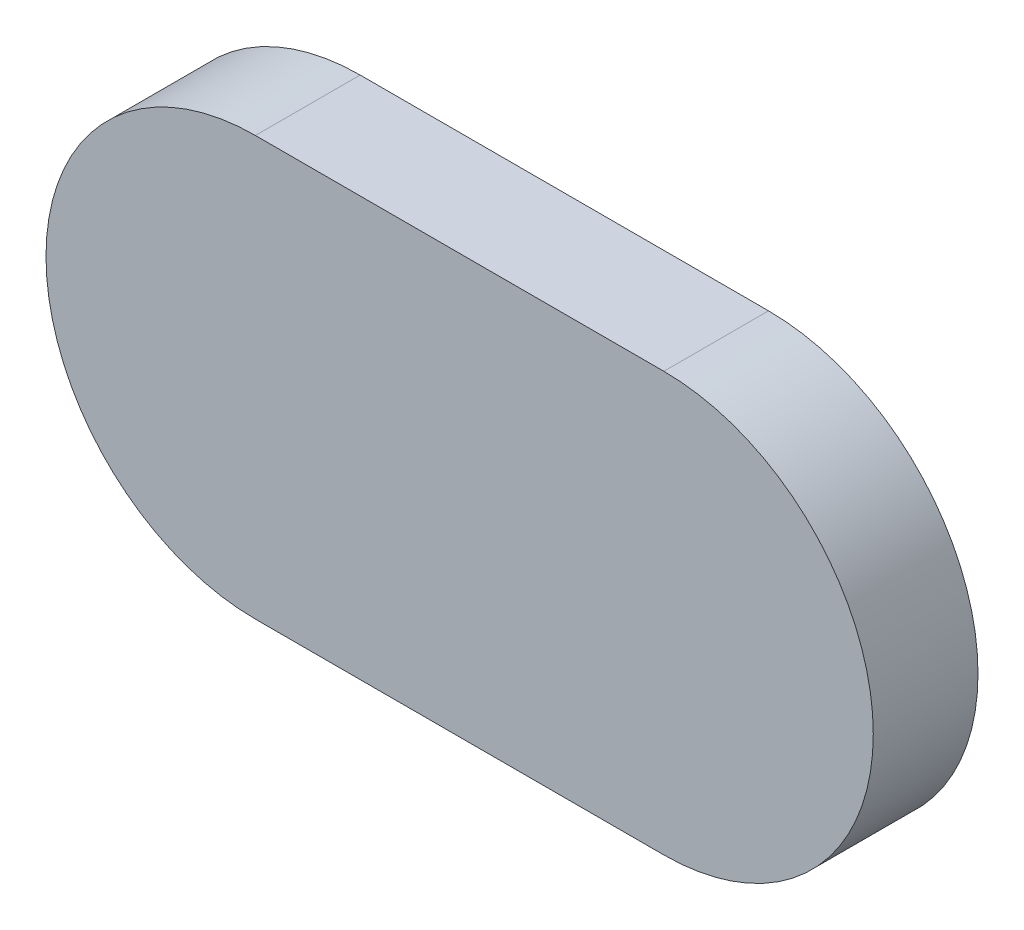
ISO-10303-21;
HEADER;
FILE_DESCRIPTION(('STEP AP214'),'2;1');
FILE_NAME('part.step','',(''),(''),'','','');
FILE_SCHEMA(('AUTOMOTIVE_DESIGN { 1 0 10303 214 1 1 1 1 }'));
ENDSEC;
DATA;
#1=APPLICATION_CONTEXT('core data for automotive mechanical design processes');
#2=APPLICATION_PROTOCOL_DEFINITION('international standard','automotive_design',2000,#1);
#3=PRODUCT_CONTEXT('',#1,'mechanical');
#4=PRODUCT('Part','Part','',(#3));
#5=PRODUCT_RELATED_PRODUCT_CATEGORY('part','',(#4));
#6=PRODUCT_DEFINITION_FORMATION('','',#4);
#7=PRODUCT_DEFINITION_CONTEXT('part definition',#1,'design');
#8=PRODUCT_DEFINITION('design','',#6,#7);
#9=PRODUCT_DEFINITION_SHAPE('','',#8);
#10=(LENGTH_UNIT() NAMED_UNIT(*) SI_UNIT(.MILLI.,.METRE.));
#11=(NAMED_UNIT(*) PLANE_ANGLE_UNIT() SI_UNIT($,.RADIAN.));
#12=(NAMED_UNIT(*) SI_UNIT($,.STERADIAN.) SOLID_ANGLE_UNIT());
#13=UNCERTAINTY_MEASURE_WITH_UNIT(LENGTH_MEASURE(1.E-05),#10,'distance_accuracy_value','');
#14=(GEOMETRIC_REPRESENTATION_CONTEXT(3) GLOBAL_UNCERTAINTY_ASSIGNED_CONTEXT((#13)) GLOBAL_UNIT_ASSIGNED_CONTEXT((#10,
#11,#12)) REPRESENTATION_CONTEXT('',''));
#15=CARTESIAN_POINT('',(0.,0.,0.));
#16=DIRECTION('',(0.,0.,1.));
#17=DIRECTION('',(1.,0.,0.));
#18=AXIS2_PLACEMENT_3D('',#15,#16,#17);
#19=CARTESIAN_POINT('',(-19.5,0.,10.));
#20=DIRECTION('',(0.,0.,-1.));
#21=DIRECTION('',(-1.,0.,0.));
#22=AXIS2_PLACEMENT_3D('',#19,#20,#21);
#23=CYLINDRICAL_SURFACE('',#22,20.);
#24=CARTESIAN_POINT('',(-19.5,0.,0.));
#25=DIRECTION('',(0.,0.,1.));
#26=DIRECTION('',(1.,0.,0.));
#27=AXIS2_PLACEMENT_3D('',#24,#25,#26);
#28=CIRCLE('',#27,20.);
#29=CARTESIAN_POINT('',(-19.5,20.,0.));
#30=VERTEX_POINT('',#29);
#31=CARTESIAN_POINT('',(-19.5,-20.,0.));
#32=VERTEX_POINT('',#31);
#33=EDGE_CURVE('E104',#30,#32,#28,.T.);
#34=ORIENTED_EDGE('',*,*,#33,.T.);
#35=DIRECTION('',(0.,0.,-1.));
#36=VECTOR('',#35,1.);
#37=CARTESIAN_POINT('',(-19.5,-20.,10.));
#38=LINE('',#37,#36);
#39=CARTESIAN_POINT('',(-19.5,-20.,10.));
#40=VERTEX_POINT('',#39);
#41=EDGE_CURVE('E11',#40,#32,#38,.T.);
#42=ORIENTED_EDGE('',*,*,#41,.F.);
#43=CARTESIAN_POINT('',(-19.5,0.,10.));
#44=DIRECTION('',(0.,0.,1.));
#45=DIRECTION('',(1.,0.,0.));
#46=AXIS2_PLACEMENT_3D('',#43,#44,#45);
#47=CIRCLE('',#46,20.);
#48=CARTESIAN_POINT('',(-19.5,20.,10.));
#49=VERTEX_POINT('',#48);
#50=EDGE_CURVE('E92',#49,#40,#47,.T.);
#51=ORIENTED_EDGE('',*,*,#50,.F.);
#52=DIRECTION('',(0.,0.,-1.));
#53=VECTOR('',#52,1.);
#54=CARTESIAN_POINT('',(-19.5,20.,10.));
#55=LINE('',#54,#53);
#56=EDGE_CURVE('E100',#49,#30,#55,.T.);
#57=ORIENTED_EDGE('',*,*,#56,.T.);
#58=EDGE_LOOP('',(#34,#42,#51,#57));
#59=FACE_BOUND('',#58,.T.);
#60=ADVANCED_FACE('F41',(#59),#23,.T.);
#61=CARTESIAN_POINT('',(-19.5,-20.,10.));
#62=DIRECTION('',(0.,1.,0.));
#63=DIRECTION('',(0.,0.,1.));
#64=AXIS2_PLACEMENT_3D('',#61,#62,#63);
#65=PLANE('',#64);
#66=DIRECTION('',(1.,0.,0.));
#67=VECTOR('',#66,1.);
#68=CARTESIAN_POINT('',(-19.5,-20.,0.));
#69=LINE('',#68,#67);
#70=CARTESIAN_POINT('',(19.5,-20.,0.));
#71=VERTEX_POINT('',#70);
#72=EDGE_CURVE('E96',#32,#71,#69,.T.);
#73=ORIENTED_EDGE('',*,*,#72,.T.);
#74=DIRECTION('',(0.,0.,-1.));
#75=VECTOR('',#74,1.);
#76=CARTESIAN_POINT('',(19.5,-20.,10.));
#77=LINE('',#76,#75);
#78=CARTESIAN_POINT('',(19.5,-20.,10.));
#79=VERTEX_POINT('',#78);
#80=EDGE_CURVE('E49',#79,#71,#77,.T.);
#81=ORIENTED_EDGE('',*,*,#80,.F.);
#82=DIRECTION('',(1.,0.,0.));
#83=VECTOR('',#82,1.);
#84=CARTESIAN_POINT('',(-19.5,-20.,10.));
#85=LINE('',#84,#83);
#86=EDGE_CURVE('E87',#40,#79,#85,.T.);
#87=ORIENTED_EDGE('',*,*,#86,.F.);
#88=ORIENTED_EDGE('',*,*,#41,.T.);
#89=EDGE_LOOP('',(#73,#81,#87,#88));
#90=FACE_BOUND('',#89,.T.);
#91=ADVANCED_FACE('F95',(#90),#65,.F.);
#92=CARTESIAN_POINT('',(19.5,0.,10.));
#93=DIRECTION('',(0.,0.,-1.));
#94=DIRECTION('',(-1.,0.,0.));
#95=AXIS2_PLACEMENT_3D('',#92,#93,#94);
#96=CYLINDRICAL_SURFACE('',#95,20.);
#97=CARTESIAN_POINT('',(19.5,0.,0.));
#98=DIRECTION('',(0.,0.,1.));
#99=DIRECTION('',(1.,0.,0.));
#100=AXIS2_PLACEMENT_3D('',#97,#98,#99);
#101=CIRCLE('',#100,20.);
#102=CARTESIAN_POINT('',(19.5,20.,0.));
#103=VERTEX_POINT('',#102);
#104=EDGE_CURVE('E74',#71,#103,#101,.T.);
#105=ORIENTED_EDGE('',*,*,#104,.T.);
#106=DIRECTION('',(0.,0.,-1.));
#107=VECTOR('',#106,1.);
#108=CARTESIAN_POINT('',(19.5,20.,10.));
#109=LINE('',#108,#107);
#110=CARTESIAN_POINT('',(19.5,20.,10.));
#111=VERTEX_POINT('',#110);
#112=EDGE_CURVE('E97',#111,#103,#109,.T.);
#113=ORIENTED_EDGE('',*,*,#112,.F.);
#114=CARTESIAN_POINT('',(19.5,0.,10.));
#115=DIRECTION('',(0.,0.,1.));
#116=DIRECTION('',(1.,0.,0.));
#117=AXIS2_PLACEMENT_3D('',#114,#115,#116);
#118=CIRCLE('',#117,20.);
#119=EDGE_CURVE('E90',#79,#111,#118,.T.);
#120=ORIENTED_EDGE('',*,*,#119,.F.);
#121=ORIENTED_EDGE('',*,*,#80,.T.);
#122=EDGE_LOOP('',(#105,#113,#120,#121));
#123=FACE_BOUND('',#122,.T.);
#124=ADVANCED_FACE('F98',(#123),#96,.T.);
#125=CARTESIAN_POINT('',(-19.5,20.,10.));
#126=DIRECTION('',(0.,-1.,0.));
#127=DIRECTION('',(0.,0.,-1.));
#128=AXIS2_PLACEMENT_3D('',#125,#126,#127);
#129=PLANE('',#128);
#130=DIRECTION('',(-1.,0.,0.));
#131=VECTOR('',#130,1.);
#132=CARTESIAN_POINT('',(-19.5,20.,0.));
#133=LINE('',#132,#131);
#134=EDGE_CURVE('E80',#103,#30,#133,.T.);
#135=ORIENTED_EDGE('',*,*,#134,.T.);
#136=ORIENTED_EDGE('',*,*,#56,.F.);
#137=DIRECTION('',(-1.,0.,0.));
#138=VECTOR('',#137,1.);
#139=CARTESIAN_POINT('',(-19.5,20.,10.));
#140=LINE('',#139,#138);
#141=EDGE_CURVE('E57',#111,#49,#140,.T.);
#142=ORIENTED_EDGE('',*,*,#141,.F.);
#143=ORIENTED_EDGE('',*,*,#112,.T.);
#144=EDGE_LOOP('',(#135,#136,#142,#143));
#145=FACE_BOUND('',#144,.T.);
#146=ADVANCED_FACE('F111',(#145),#129,.F.);
#147=CARTESIAN_POINT('',(-19.5,0.,10.));
#148=DIRECTION('',(0.,0.,1.));
#149=DIRECTION('',(1.,0.,0.));
#150=AXIS2_PLACEMENT_3D('',#147,#148,#149);
#151=PLANE('',#150);
#152=ORIENTED_EDGE('',*,*,#50,.T.);
#153=ORIENTED_EDGE('',*,*,#86,.T.);
#154=ORIENTED_EDGE('',*,*,#119,.T.);
#155=ORIENTED_EDGE('',*,*,#141,.T.);
#156=EDGE_LOOP('',(#152,#153,#154,#155));
#157=FACE_BOUND('',#156,.T.);
#158=ADVANCED_FACE('F88',(#157),#151,.T.);
#159=CARTESIAN_POINT('',(-19.5,0.,0.));
#160=DIRECTION('',(0.,0.,1.));
#161=DIRECTION('',(1.,0.,0.));
#162=AXIS2_PLACEMENT_3D('',#159,#160,#161);
#163=PLANE('',#162);
#164=ORIENTED_EDGE('',*,*,#33,.F.);
#165=ORIENTED_EDGE('',*,*,#134,.F.);
#166=ORIENTED_EDGE('',*,*,#104,.F.);
#167=ORIENTED_EDGE('',*,*,#72,.F.);
#168=EDGE_LOOP('',(#164,#165,#166,#167));
#169=FACE_BOUND('',#168,.T.);
#170=ADVANCED_FACE('F114',(#169),#163,.F.);
#171=CLOSED_SHELL('',(#60,#91,#124,#146,#158,#170));
#172=MANIFOLD_SOLID_BREP('B2',#171);
#173=ADVANCED_BREP_SHAPE_REPRESENTATION('',(#18,#172),#14);
#174=SHAPE_DEFINITION_REPRESENTATION(#9,#173);
ENDSEC;
END-ISO-10303-21;
